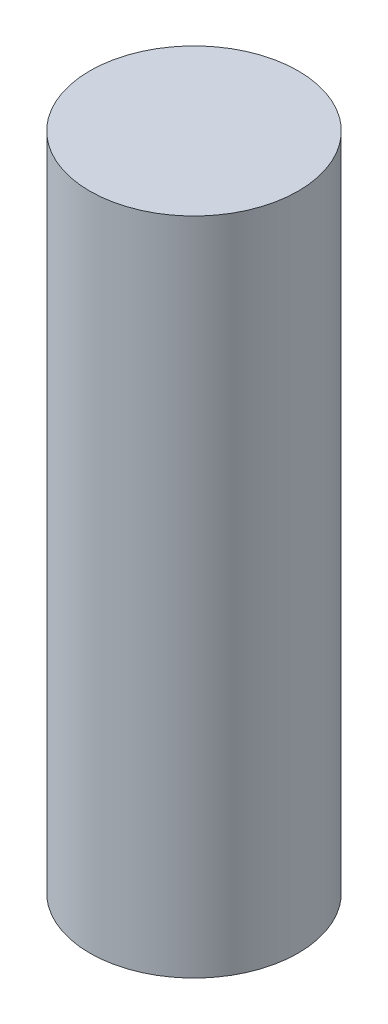
ISO-10303-21;
HEADER;
FILE_DESCRIPTION(('STEP AP214'),'2;1');
FILE_NAME('part.step','',(''),(''),'','','');
FILE_SCHEMA(('AUTOMOTIVE_DESIGN { 1 0 10303 214 1 1 1 1 }'));
ENDSEC;
DATA;
#1=APPLICATION_CONTEXT('core data for automotive mechanical design processes');
#2=APPLICATION_PROTOCOL_DEFINITION('international standard','automotive_design',2000,#1);
#3=PRODUCT_CONTEXT('',#1,'mechanical');
#4=PRODUCT('Part','Part','',(#3));
#5=PRODUCT_RELATED_PRODUCT_CATEGORY('part','',(#4));
#6=PRODUCT_DEFINITION_FORMATION('','',#4);
#7=PRODUCT_DEFINITION_CONTEXT('part definition',#1,'design');
#8=PRODUCT_DEFINITION('design','',#6,#7);
#9=PRODUCT_DEFINITION_SHAPE('','',#8);
#10=(LENGTH_UNIT() NAMED_UNIT(*) SI_UNIT(.MILLI.,.METRE.));
#11=(NAMED_UNIT(*) PLANE_ANGLE_UNIT() SI_UNIT($,.RADIAN.));
#12=(NAMED_UNIT(*) SI_UNIT($,.STERADIAN.) SOLID_ANGLE_UNIT());
#13=UNCERTAINTY_MEASURE_WITH_UNIT(LENGTH_MEASURE(1.E-05),#10,'distance_accuracy_value','');
#14=(GEOMETRIC_REPRESENTATION_CONTEXT(3) GLOBAL_UNCERTAINTY_ASSIGNED_CONTEXT((#13)) GLOBAL_UNIT_ASSIGNED_CONTEXT((#10,
#11,#12)) REPRESENTATION_CONTEXT('',''));
#15=CARTESIAN_POINT('',(0.,0.,0.));
#16=DIRECTION('',(0.,0.,1.));
#17=DIRECTION('',(1.,0.,0.));
#18=AXIS2_PLACEMENT_3D('',#15,#16,#17);
#19=CARTESIAN_POINT('',(0.,19.,0.));
#20=DIRECTION('',(0.,-1.,0.));
#21=DIRECTION('',(0.,0.,-1.));
#22=AXIS2_PLACEMENT_3D('',#19,#20,#21);
#23=CYLINDRICAL_SURFACE('',#22,3.);
#24=CARTESIAN_POINT('',(0.,19.,0.));
#25=DIRECTION('',(0.,1.,0.));
#26=DIRECTION('',(0.,0.,1.));
#27=AXIS2_PLACEMENT_3D('',#24,#25,#26);
#28=CIRCLE('',#27,3.);
#29=CARTESIAN_POINT('',(0.,19.,3.));
#30=VERTEX_POINT('',#29);
#31=EDGE_CURVE('E10',#30,#30,#28,.T.);
#32=ORIENTED_EDGE('',*,*,#31,.F.);
#33=EDGE_LOOP('',(#32));
#34=FACE_BOUND('',#33,.T.);
#35=CARTESIAN_POINT('',(0.,0.,0.));
#36=DIRECTION('',(0.,1.,0.));
#37=DIRECTION('',(0.,0.,1.));
#38=AXIS2_PLACEMENT_3D('',#35,#36,#37);
#39=CIRCLE('',#38,3.);
#40=CARTESIAN_POINT('',(0.,0.,3.));
#41=VERTEX_POINT('',#40);
#42=EDGE_CURVE('E44',#41,#41,#39,.T.);
#43=ORIENTED_EDGE('',*,*,#42,.T.);
#44=EDGE_LOOP('',(#43));
#45=FACE_BOUND('',#44,.T.);
#46=ADVANCED_FACE('F41',(#34,#45),#23,.T.);
#47=CARTESIAN_POINT('',(0.,19.,0.));
#48=DIRECTION('',(0.,1.,0.));
#49=DIRECTION('',(0.,0.,1.));
#50=AXIS2_PLACEMENT_3D('',#47,#48,#49);
#51=PLANE('',#50);
#52=ORIENTED_EDGE('',*,*,#31,.T.);
#53=EDGE_LOOP('',(#52));
#54=FACE_BOUND('',#53,.T.);
#55=ADVANCED_FACE('F58',(#54),#51,.T.);
#56=CARTESIAN_POINT('',(0.,0.,0.));
#57=DIRECTION('',(0.,1.,0.));
#58=DIRECTION('',(0.,0.,1.));
#59=AXIS2_PLACEMENT_3D('',#56,#57,#58);
#60=PLANE('',#59);
#61=ORIENTED_EDGE('',*,*,#42,.F.);
#62=EDGE_LOOP('',(#61));
#63=FACE_BOUND('',#62,.T.);
#64=ADVANCED_FACE('F56',(#63),#60,.F.);
#65=CLOSED_SHELL('',(#46,#55,#64));
#66=MANIFOLD_SOLID_BREP('B2',#65);
#67=ADVANCED_BREP_SHAPE_REPRESENTATION('',(#18,#66),#14);
#68=SHAPE_DEFINITION_REPRESENTATION(#9,#67);
ENDSEC;
END-ISO-10303-21;
